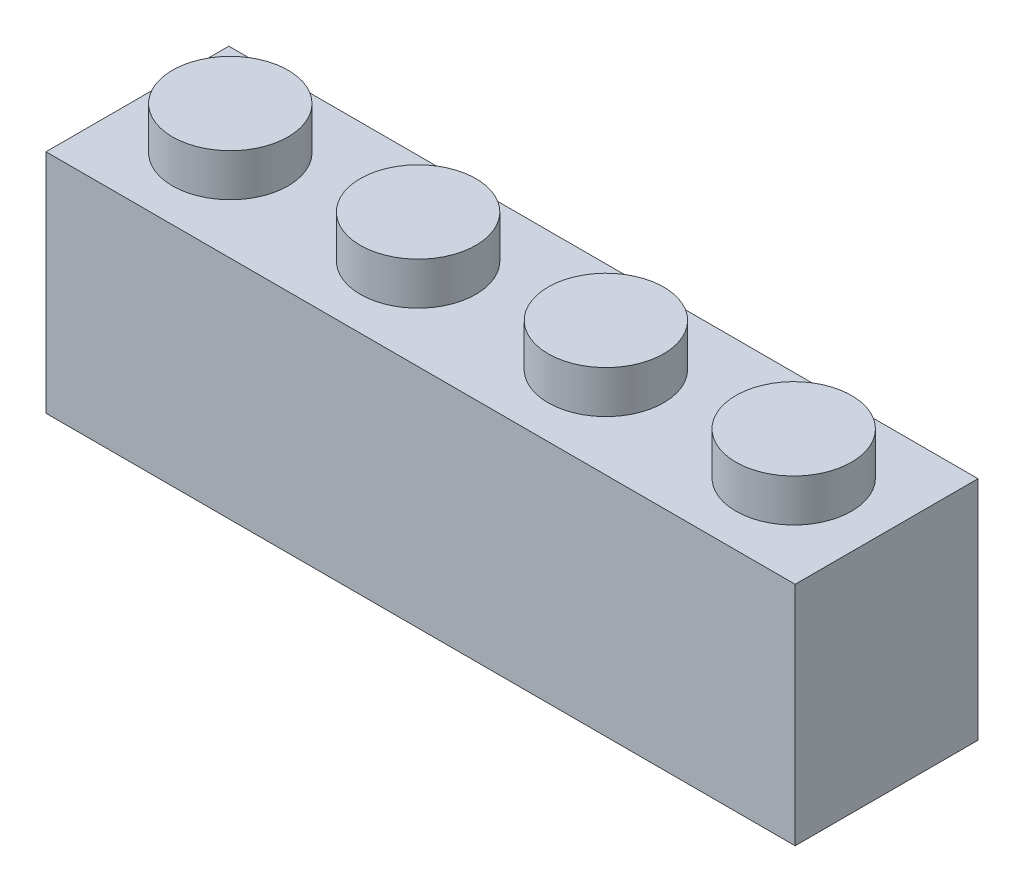
ISO-10303-21;
HEADER;
FILE_DESCRIPTION(('STEP AP214'),'2;1');
FILE_NAME('part.step','',(''),(''),'','','');
FILE_SCHEMA(('AUTOMOTIVE_DESIGN { 1 0 10303 214 1 1 1 1 }'));
ENDSEC;
DATA;
#1=APPLICATION_CONTEXT('core data for automotive mechanical design processes');
#2=APPLICATION_PROTOCOL_DEFINITION('international standard','automotive_design',2000,#1);
#3=PRODUCT_CONTEXT('',#1,'mechanical');
#4=PRODUCT('Part','Part','',(#3));
#5=PRODUCT_RELATED_PRODUCT_CATEGORY('part','',(#4));
#6=PRODUCT_DEFINITION_FORMATION('','',#4);
#7=PRODUCT_DEFINITION_CONTEXT('part definition',#1,'design');
#8=PRODUCT_DEFINITION('design','',#6,#7);
#9=PRODUCT_DEFINITION_SHAPE('','',#8);
#10=(LENGTH_UNIT() NAMED_UNIT(*) SI_UNIT(.MILLI.,.METRE.));
#11=(NAMED_UNIT(*) PLANE_ANGLE_UNIT() SI_UNIT($,.RADIAN.));
#12=(NAMED_UNIT(*) SI_UNIT($,.STERADIAN.) SOLID_ANGLE_UNIT());
#13=UNCERTAINTY_MEASURE_WITH_UNIT(LENGTH_MEASURE(1.E-05),#10,'distance_accuracy_value','');
#14=(GEOMETRIC_REPRESENTATION_CONTEXT(3) GLOBAL_UNCERTAINTY_ASSIGNED_CONTEXT((#13)) GLOBAL_UNIT_ASSIGNED_CONTEXT((#10,
#11,#12)) REPRESENTATION_CONTEXT('',''));
#15=CARTESIAN_POINT('',(0.,0.,0.));
#16=DIRECTION('',(0.,0.,1.));
#17=DIRECTION('',(1.,0.,0.));
#18=AXIS2_PLACEMENT_3D('',#15,#16,#17);
#19=CARTESIAN_POINT('',(15.875,-9.6,-3.875));
#20=DIRECTION('',(1.,0.,0.));
#21=DIRECTION('',(0.,0.,-1.));
#22=AXIS2_PLACEMENT_3D('',#19,#20,#21);
#23=PLANE('',#22);
#24=DIRECTION('',(0.,0.,-1.));
#25=VECTOR('',#24,1.);
#26=CARTESIAN_POINT('',(15.875,0.,-3.875));
#27=LINE('',#26,#25);
#28=CARTESIAN_POINT('',(15.875,0.,3.875));
#29=VERTEX_POINT('',#28);
#30=CARTESIAN_POINT('',(15.875,0.,-3.875));
#31=VERTEX_POINT('',#30);
#32=EDGE_CURVE('E191',#29,#31,#27,.T.);
#33=ORIENTED_EDGE('',*,*,#32,.F.);
#34=DIRECTION('',(0.,1.,0.));
#35=VECTOR('',#34,1.);
#36=CARTESIAN_POINT('',(15.875,-9.6,3.875));
#37=LINE('',#36,#35);
#38=CARTESIAN_POINT('',(15.875,-9.6,3.875));
#39=VERTEX_POINT('',#38);
#40=EDGE_CURVE('E11',#39,#29,#37,.T.);
#41=ORIENTED_EDGE('',*,*,#40,.F.);
#42=DIRECTION('',(0.,0.,-1.));
#43=VECTOR('',#42,1.);
#44=CARTESIAN_POINT('',(15.875,-9.6,-3.875));
#45=LINE('',#44,#43);
#46=CARTESIAN_POINT('',(15.875,-9.6,-3.875));
#47=VERTEX_POINT('',#46);
#48=EDGE_CURVE('E194',#39,#47,#45,.T.);
#49=ORIENTED_EDGE('',*,*,#48,.T.);
#50=DIRECTION('',(0.,1.,0.));
#51=VECTOR('',#50,1.);
#52=CARTESIAN_POINT('',(15.875,-9.6,-3.875));
#53=LINE('',#52,#51);
#54=EDGE_CURVE('E36',#47,#31,#53,.T.);
#55=ORIENTED_EDGE('',*,*,#54,.T.);
#56=EDGE_LOOP('',(#33,#41,#49,#55));
#57=FACE_BOUND('',#56,.T.);
#58=ADVANCED_FACE('F33',(#57),#23,.T.);
#59=CARTESIAN_POINT('',(-15.875,-9.6,3.875));
#60=DIRECTION('',(0.,0.,1.));
#61=DIRECTION('',(1.,0.,0.));
#62=AXIS2_PLACEMENT_3D('',#59,#60,#61);
#63=PLANE('',#62);
#64=DIRECTION('',(1.,0.,0.));
#65=VECTOR('',#64,1.);
#66=CARTESIAN_POINT('',(-15.875,0.,3.875));
#67=LINE('',#66,#65);
#68=CARTESIAN_POINT('',(-15.875,0.,3.875));
#69=VERTEX_POINT('',#68);
#70=EDGE_CURVE('E197',#69,#29,#67,.T.);
#71=ORIENTED_EDGE('',*,*,#70,.F.);
#72=DIRECTION('',(0.,1.,0.));
#73=VECTOR('',#72,1.);
#74=CARTESIAN_POINT('',(-15.875,-9.6,3.875));
#75=LINE('',#74,#73);
#76=CARTESIAN_POINT('',(-15.875,-9.6,3.875));
#77=VERTEX_POINT('',#76);
#78=EDGE_CURVE('E41',#77,#69,#75,.T.);
#79=ORIENTED_EDGE('',*,*,#78,.F.);
#80=DIRECTION('',(1.,0.,0.));
#81=VECTOR('',#80,1.);
#82=CARTESIAN_POINT('',(-15.875,-9.6,3.875));
#83=LINE('',#82,#81);
#84=EDGE_CURVE('E202',#77,#39,#83,.T.);
#85=ORIENTED_EDGE('',*,*,#84,.T.);
#86=ORIENTED_EDGE('',*,*,#40,.T.);
#87=EDGE_LOOP('',(#71,#79,#85,#86));
#88=FACE_BOUND('',#87,.T.);
#89=ADVANCED_FACE('F219',(#88),#63,.T.);
#90=CARTESIAN_POINT('',(-15.875,-9.6,-3.875));
#91=DIRECTION('',(-1.,0.,0.));
#92=DIRECTION('',(0.,0.,1.));
#93=AXIS2_PLACEMENT_3D('',#90,#91,#92);
#94=PLANE('',#93);
#95=DIRECTION('',(0.,0.,1.));
#96=VECTOR('',#95,1.);
#97=CARTESIAN_POINT('',(-15.875,0.,-3.875));
#98=LINE('',#97,#96);
#99=CARTESIAN_POINT('',(-15.875,0.,-3.875));
#100=VERTEX_POINT('',#99);
#101=EDGE_CURVE('E209',#100,#69,#98,.T.);
#102=ORIENTED_EDGE('',*,*,#101,.F.);
#103=DIRECTION('',(0.,1.,0.));
#104=VECTOR('',#103,1.);
#105=CARTESIAN_POINT('',(-15.875,-9.6,-3.875));
#106=LINE('',#105,#104);
#107=CARTESIAN_POINT('',(-15.875,-9.6,-3.875));
#108=VERTEX_POINT('',#107);
#109=EDGE_CURVE('E214',#108,#100,#106,.T.);
#110=ORIENTED_EDGE('',*,*,#109,.F.);
#111=DIRECTION('',(0.,0.,1.));
#112=VECTOR('',#111,1.);
#113=CARTESIAN_POINT('',(-15.875,-9.6,-3.875));
#114=LINE('',#113,#112);
#115=EDGE_CURVE('E199',#108,#77,#114,.T.);
#116=ORIENTED_EDGE('',*,*,#115,.T.);
#117=ORIENTED_EDGE('',*,*,#78,.T.);
#118=EDGE_LOOP('',(#102,#110,#116,#117));
#119=FACE_BOUND('',#118,.T.);
#120=ADVANCED_FACE('F223',(#119),#94,.T.);
#121=CARTESIAN_POINT('',(-15.875,-9.6,-3.875));
#122=DIRECTION('',(0.,0.,-1.));
#123=DIRECTION('',(-1.,0.,0.));
#124=AXIS2_PLACEMENT_3D('',#121,#122,#123);
#125=PLANE('',#124);
#126=DIRECTION('',(-1.,0.,0.));
#127=VECTOR('',#126,1.);
#128=CARTESIAN_POINT('',(-15.875,0.,-3.875));
#129=LINE('',#128,#127);
#130=EDGE_CURVE('E206',#31,#100,#129,.T.);
#131=ORIENTED_EDGE('',*,*,#130,.F.);
#132=ORIENTED_EDGE('',*,*,#54,.F.);
#133=DIRECTION('',(-1.,0.,0.));
#134=VECTOR('',#133,1.);
#135=CARTESIAN_POINT('',(-15.875,-9.6,-3.875));
#136=LINE('',#135,#134);
#137=EDGE_CURVE('E196',#47,#108,#136,.T.);
#138=ORIENTED_EDGE('',*,*,#137,.T.);
#139=ORIENTED_EDGE('',*,*,#109,.T.);
#140=EDGE_LOOP('',(#131,#132,#138,#139));
#141=FACE_BOUND('',#140,.T.);
#142=ADVANCED_FACE('F216',(#141),#125,.T.);
#143=CARTESIAN_POINT('',(0.,-9.6,0.));
#144=DIRECTION('',(0.,1.,0.));
#145=DIRECTION('',(0.,0.,1.));
#146=AXIS2_PLACEMENT_3D('',#143,#144,#145);
#147=PLANE('',#146);
#148=DIRECTION('',(1.,0.,0.));
#149=VECTOR('',#148,1.);
#150=CARTESIAN_POINT('',(0.,-9.6,2.375));
#151=LINE('',#150,#149);
#152=CARTESIAN_POINT('',(-14.375,-9.6,2.375));
#153=VERTEX_POINT('',#152);
#154=CARTESIAN_POINT('',(14.375,-9.6,2.375));
#155=VERTEX_POINT('',#154);
#156=EDGE_CURVE('E165',#153,#155,#151,.T.);
#157=ORIENTED_EDGE('',*,*,#156,.T.);
#158=DIRECTION('',(0.,0.,-1.));
#159=VECTOR('',#158,1.);
#160=CARTESIAN_POINT('',(14.375,-9.6,0.));
#161=LINE('',#160,#159);
#162=CARTESIAN_POINT('',(14.375,-9.6,-2.375));
#163=VERTEX_POINT('',#162);
#164=EDGE_CURVE('E110',#155,#163,#161,.T.);
#165=ORIENTED_EDGE('',*,*,#164,.T.);
#166=DIRECTION('',(-1.,0.,0.));
#167=VECTOR('',#166,1.);
#168=CARTESIAN_POINT('',(0.,-9.6,-2.375));
#169=LINE('',#168,#167);
#170=CARTESIAN_POINT('',(-14.375,-9.6,-2.375));
#171=VERTEX_POINT('',#170);
#172=EDGE_CURVE('E132',#163,#171,#169,.T.);
#173=ORIENTED_EDGE('',*,*,#172,.T.);
#174=DIRECTION('',(0.,0.,1.));
#175=VECTOR('',#174,1.);
#176=CARTESIAN_POINT('',(-14.375,-9.6,0.));
#177=LINE('',#176,#175);
#178=EDGE_CURVE('E49',#171,#153,#177,.T.);
#179=ORIENTED_EDGE('',*,*,#178,.T.);
#180=EDGE_LOOP('',(#157,#165,#173,#179));
#181=FACE_BOUND('',#180,.T.);
#182=ORIENTED_EDGE('',*,*,#48,.F.);
#183=ORIENTED_EDGE('',*,*,#84,.F.);
#184=ORIENTED_EDGE('',*,*,#115,.F.);
#185=ORIENTED_EDGE('',*,*,#137,.F.);
#186=EDGE_LOOP('',(#182,#183,#184,#185));
#187=FACE_BOUND('',#186,.T.);
#188=ADVANCED_FACE('F225',(#181,#187),#147,.F.);
#189=CARTESIAN_POINT('',(0.,0.,0.));
#190=DIRECTION('',(0.,1.,0.));
#191=DIRECTION('',(0.,0.,1.));
#192=AXIS2_PLACEMENT_3D('',#189,#190,#191);
#193=PLANE('',#192);
#194=CARTESIAN_POINT('',(11.94,0.,0.));
#195=DIRECTION('',(0.,1.,0.));
#196=DIRECTION('',(0.,0.,1.));
#197=AXIS2_PLACEMENT_3D('',#194,#195,#196);
#198=CIRCLE('',#197,2.45);
#199=CARTESIAN_POINT('',(11.94,0.,2.45));
#200=VERTEX_POINT('',#199);
#201=EDGE_CURVE('E115',#200,#200,#198,.T.);
#202=ORIENTED_EDGE('',*,*,#201,.F.);
#203=EDGE_LOOP('',(#202));
#204=FACE_BOUND('',#203,.T.);
#205=CARTESIAN_POINT('',(3.98,0.,0.));
#206=DIRECTION('',(0.,1.,0.));
#207=DIRECTION('',(0.,0.,1.));
#208=AXIS2_PLACEMENT_3D('',#205,#206,#207);
#209=CIRCLE('',#208,2.45);
#210=CARTESIAN_POINT('',(3.98,0.,2.45));
#211=VERTEX_POINT('',#210);
#212=EDGE_CURVE('E173',#211,#211,#209,.T.);
#213=ORIENTED_EDGE('',*,*,#212,.F.);
#214=EDGE_LOOP('',(#213));
#215=FACE_BOUND('',#214,.T.);
#216=CARTESIAN_POINT('',(-3.98,0.,0.));
#217=DIRECTION('',(0.,1.,0.));
#218=DIRECTION('',(0.,0.,1.));
#219=AXIS2_PLACEMENT_3D('',#216,#217,#218);
#220=CIRCLE('',#219,2.45);
#221=CARTESIAN_POINT('',(-3.98,0.,2.45));
#222=VERTEX_POINT('',#221);
#223=EDGE_CURVE('E179',#222,#222,#220,.T.);
#224=ORIENTED_EDGE('',*,*,#223,.F.);
#225=EDGE_LOOP('',(#224));
#226=FACE_BOUND('',#225,.T.);
#227=CARTESIAN_POINT('',(-11.94,0.,0.));
#228=DIRECTION('',(0.,1.,0.));
#229=DIRECTION('',(0.,0.,1.));
#230=AXIS2_PLACEMENT_3D('',#227,#228,#229);
#231=CIRCLE('',#230,2.45);
#232=CARTESIAN_POINT('',(-11.94,0.,2.45));
#233=VERTEX_POINT('',#232);
#234=EDGE_CURVE('E185',#233,#233,#231,.T.);
#235=ORIENTED_EDGE('',*,*,#234,.F.);
#236=EDGE_LOOP('',(#235));
#237=FACE_BOUND('',#236,.T.);
#238=ORIENTED_EDGE('',*,*,#32,.T.);
#239=ORIENTED_EDGE('',*,*,#130,.T.);
#240=ORIENTED_EDGE('',*,*,#101,.T.);
#241=ORIENTED_EDGE('',*,*,#70,.T.);
#242=EDGE_LOOP('',(#238,#239,#240,#241));
#243=FACE_BOUND('',#242,.T.);
#244=ADVANCED_FACE('F218',(#204,#215,#226,#237,#243),#193,.T.);
#245=CARTESIAN_POINT('',(-11.94,1.8,0.));
#246=DIRECTION('',(0.,-1.,0.));
#247=DIRECTION('',(0.,0.,-1.));
#248=AXIS2_PLACEMENT_3D('',#245,#246,#247);
#249=CYLINDRICAL_SURFACE('',#248,2.45);
#250=CARTESIAN_POINT('',(-11.94,1.8,0.));
#251=DIRECTION('',(0.,1.,0.));
#252=DIRECTION('',(0.,0.,1.));
#253=AXIS2_PLACEMENT_3D('',#250,#251,#252);
#254=CIRCLE('',#253,2.45);
#255=CARTESIAN_POINT('',(-11.94,1.8,2.45));
#256=VERTEX_POINT('',#255);
#257=EDGE_CURVE('E188',#256,#256,#254,.T.);
#258=ORIENTED_EDGE('',*,*,#257,.F.);
#259=EDGE_LOOP('',(#258));
#260=FACE_BOUND('',#259,.T.);
#261=ORIENTED_EDGE('',*,*,#234,.T.);
#262=EDGE_LOOP('',(#261));
#263=FACE_BOUND('',#262,.T.);
#264=ADVANCED_FACE('F233',(#260,#263),#249,.T.);
#265=CARTESIAN_POINT('',(-11.94,1.8,0.));
#266=DIRECTION('',(0.,1.,0.));
#267=DIRECTION('',(0.,0.,1.));
#268=AXIS2_PLACEMENT_3D('',#265,#266,#267);
#269=PLANE('',#268);
#270=ORIENTED_EDGE('',*,*,#257,.T.);
#271=EDGE_LOOP('',(#270));
#272=FACE_BOUND('',#271,.T.);
#273=ADVANCED_FACE('F268',(#272),#269,.T.);
#274=CARTESIAN_POINT('',(-3.98,1.8,0.));
#275=DIRECTION('',(0.,-1.,0.));
#276=DIRECTION('',(0.,0.,-1.));
#277=AXIS2_PLACEMENT_3D('',#274,#275,#276);
#278=CYLINDRICAL_SURFACE('',#277,2.45);
#279=CARTESIAN_POINT('',(-3.98,1.8,0.));
#280=DIRECTION('',(0.,1.,0.));
#281=DIRECTION('',(0.,0.,1.));
#282=AXIS2_PLACEMENT_3D('',#279,#280,#281);
#283=CIRCLE('',#282,2.45);
#284=CARTESIAN_POINT('',(-3.98,1.8,2.45));
#285=VERTEX_POINT('',#284);
#286=EDGE_CURVE('E182',#285,#285,#283,.T.);
#287=ORIENTED_EDGE('',*,*,#286,.F.);
#288=EDGE_LOOP('',(#287));
#289=FACE_BOUND('',#288,.T.);
#290=ORIENTED_EDGE('',*,*,#223,.T.);
#291=EDGE_LOOP('',(#290));
#292=FACE_BOUND('',#291,.T.);
#293=ADVANCED_FACE('F277',(#289,#292),#278,.T.);
#294=CARTESIAN_POINT('',(-3.98,1.8,0.));
#295=DIRECTION('',(0.,1.,0.));
#296=DIRECTION('',(0.,0.,1.));
#297=AXIS2_PLACEMENT_3D('',#294,#295,#296);
#298=PLANE('',#297);
#299=ORIENTED_EDGE('',*,*,#286,.T.);
#300=EDGE_LOOP('',(#299));
#301=FACE_BOUND('',#300,.T.);
#302=ADVANCED_FACE('F287',(#301),#298,.T.);
#303=CARTESIAN_POINT('',(3.98,1.8,0.));
#304=DIRECTION('',(0.,-1.,0.));
#305=DIRECTION('',(0.,0.,-1.));
#306=AXIS2_PLACEMENT_3D('',#303,#304,#305);
#307=CYLINDRICAL_SURFACE('',#306,2.45);
#308=CARTESIAN_POINT('',(3.98,1.8,0.));
#309=DIRECTION('',(0.,1.,0.));
#310=DIRECTION('',(0.,0.,1.));
#311=AXIS2_PLACEMENT_3D('',#308,#309,#310);
#312=CIRCLE('',#311,2.45);
#313=CARTESIAN_POINT('',(3.98,1.8,2.45));
#314=VERTEX_POINT('',#313);
#315=EDGE_CURVE('E176',#314,#314,#312,.T.);
#316=ORIENTED_EDGE('',*,*,#315,.F.);
#317=EDGE_LOOP('',(#316));
#318=FACE_BOUND('',#317,.T.);
#319=ORIENTED_EDGE('',*,*,#212,.T.);
#320=EDGE_LOOP('',(#319));
#321=FACE_BOUND('',#320,.T.);
#322=ADVANCED_FACE('F297',(#318,#321),#307,.T.);
#323=CARTESIAN_POINT('',(3.98,1.8,0.));
#324=DIRECTION('',(0.,1.,0.));
#325=DIRECTION('',(0.,0.,1.));
#326=AXIS2_PLACEMENT_3D('',#323,#324,#325);
#327=PLANE('',#326);
#328=ORIENTED_EDGE('',*,*,#315,.T.);
#329=EDGE_LOOP('',(#328));
#330=FACE_BOUND('',#329,.T.);
#331=ADVANCED_FACE('F307',(#330),#327,.T.);
#332=CARTESIAN_POINT('',(11.94,1.8,0.));
#333=DIRECTION('',(0.,-1.,0.));
#334=DIRECTION('',(0.,0.,-1.));
#335=AXIS2_PLACEMENT_3D('',#332,#333,#334);
#336=CYLINDRICAL_SURFACE('',#335,2.45);
#337=CARTESIAN_POINT('',(11.94,1.8,0.));
#338=DIRECTION('',(0.,1.,0.));
#339=DIRECTION('',(0.,0.,1.));
#340=AXIS2_PLACEMENT_3D('',#337,#338,#339);
#341=CIRCLE('',#340,2.45);
#342=CARTESIAN_POINT('',(11.94,1.8,2.45));
#343=VERTEX_POINT('',#342);
#344=EDGE_CURVE('E170',#343,#343,#341,.T.);
#345=ORIENTED_EDGE('',*,*,#344,.F.);
#346=EDGE_LOOP('',(#345));
#347=FACE_BOUND('',#346,.T.);
#348=ORIENTED_EDGE('',*,*,#201,.T.);
#349=EDGE_LOOP('',(#348));
#350=FACE_BOUND('',#349,.T.);
#351=ADVANCED_FACE('F317',(#347,#350),#336,.T.);
#352=CARTESIAN_POINT('',(11.94,1.8,0.));
#353=DIRECTION('',(0.,1.,0.));
#354=DIRECTION('',(0.,0.,1.));
#355=AXIS2_PLACEMENT_3D('',#352,#353,#354);
#356=PLANE('',#355);
#357=ORIENTED_EDGE('',*,*,#344,.T.);
#358=EDGE_LOOP('',(#357));
#359=FACE_BOUND('',#358,.T.);
#360=ADVANCED_FACE('F327',(#359),#356,.T.);
#361=CARTESIAN_POINT('',(14.375,-9.6,-3.875));
#362=DIRECTION('',(1.,0.,0.));
#363=DIRECTION('',(0.,0.,-1.));
#364=AXIS2_PLACEMENT_3D('',#361,#362,#363);
#365=PLANE('',#364);
#366=DIRECTION('',(0.,0.,-1.));
#367=VECTOR('',#366,1.);
#368=CARTESIAN_POINT('',(14.375,-1.5,0.));
#369=LINE('',#368,#367);
#370=CARTESIAN_POINT('',(14.375,-1.5,2.375));
#371=VERTEX_POINT('',#370);
#372=CARTESIAN_POINT('',(14.375,-1.5,-2.375));
#373=VERTEX_POINT('',#372);
#374=EDGE_CURVE('E108',#371,#373,#369,.T.);
#375=ORIENTED_EDGE('',*,*,#374,.T.);
#376=DIRECTION('',(0.,1.,0.));
#377=VECTOR('',#376,1.);
#378=CARTESIAN_POINT('',(14.375,-9.6,-2.375));
#379=LINE('',#378,#377);
#380=EDGE_CURVE('E137',#163,#373,#379,.T.);
#381=ORIENTED_EDGE('',*,*,#380,.F.);
#382=ORIENTED_EDGE('',*,*,#164,.F.);
#383=DIRECTION('',(0.,1.,0.));
#384=VECTOR('',#383,1.);
#385=CARTESIAN_POINT('',(14.375,-9.6,2.375));
#386=LINE('',#385,#384);
#387=EDGE_CURVE('E105',#155,#371,#386,.T.);
#388=ORIENTED_EDGE('',*,*,#387,.T.);
#389=EDGE_LOOP('',(#375,#381,#382,#388));
#390=FACE_BOUND('',#389,.T.);
#391=ADVANCED_FACE('F107',(#390),#365,.F.);
#392=CARTESIAN_POINT('',(-15.875,-9.6,2.375));
#393=DIRECTION('',(0.,0.,1.));
#394=DIRECTION('',(1.,0.,0.));
#395=AXIS2_PLACEMENT_3D('',#392,#393,#394);
#396=PLANE('',#395);
#397=DIRECTION('',(1.,0.,0.));
#398=VECTOR('',#397,1.);
#399=CARTESIAN_POINT('',(0.,-1.5,2.375));
#400=LINE('',#399,#398);
#401=CARTESIAN_POINT('',(-14.375,-1.5,2.375));
#402=VERTEX_POINT('',#401);
#403=EDGE_CURVE('E123',#402,#371,#400,.T.);
#404=ORIENTED_EDGE('',*,*,#403,.T.);
#405=ORIENTED_EDGE('',*,*,#387,.F.);
#406=ORIENTED_EDGE('',*,*,#156,.F.);
#407=DIRECTION('',(0.,1.,0.));
#408=VECTOR('',#407,1.);
#409=CARTESIAN_POINT('',(-14.375,-9.6,2.375));
#410=LINE('',#409,#408);
#411=EDGE_CURVE('E116',#153,#402,#410,.T.);
#412=ORIENTED_EDGE('',*,*,#411,.T.);
#413=EDGE_LOOP('',(#404,#405,#406,#412));
#414=FACE_BOUND('',#413,.T.);
#415=ADVANCED_FACE('F128',(#414),#396,.F.);
#416=CARTESIAN_POINT('',(-14.375,-9.6,-3.875));
#417=DIRECTION('',(-1.,0.,0.));
#418=DIRECTION('',(0.,0.,1.));
#419=AXIS2_PLACEMENT_3D('',#416,#417,#418);
#420=PLANE('',#419);
#421=DIRECTION('',(0.,0.,1.));
#422=VECTOR('',#421,1.);
#423=CARTESIAN_POINT('',(-14.375,-1.5,0.));
#424=LINE('',#423,#422);
#425=CARTESIAN_POINT('',(-14.375,-1.5,-2.375));
#426=VERTEX_POINT('',#425);
#427=EDGE_CURVE('E130',#426,#402,#424,.T.);
#428=ORIENTED_EDGE('',*,*,#427,.T.);
#429=ORIENTED_EDGE('',*,*,#411,.F.);
#430=ORIENTED_EDGE('',*,*,#178,.F.);
#431=DIRECTION('',(0.,1.,0.));
#432=VECTOR('',#431,1.);
#433=CARTESIAN_POINT('',(-14.375,-9.6,-2.375));
#434=LINE('',#433,#432);
#435=EDGE_CURVE('E138',#171,#426,#434,.T.);
#436=ORIENTED_EDGE('',*,*,#435,.T.);
#437=EDGE_LOOP('',(#428,#429,#430,#436));
#438=FACE_BOUND('',#437,.T.);
#439=ADVANCED_FACE('F357',(#438),#420,.F.);
#440=CARTESIAN_POINT('',(-15.875,-9.6,-2.375));
#441=DIRECTION('',(0.,0.,-1.));
#442=DIRECTION('',(-1.,0.,0.));
#443=AXIS2_PLACEMENT_3D('',#440,#441,#442);
#444=PLANE('',#443);
#445=DIRECTION('',(-1.,0.,0.));
#446=VECTOR('',#445,1.);
#447=CARTESIAN_POINT('',(0.,-1.5,-2.375));
#448=LINE('',#447,#446);
#449=EDGE_CURVE('E125',#373,#426,#448,.T.);
#450=ORIENTED_EDGE('',*,*,#449,.T.);
#451=ORIENTED_EDGE('',*,*,#435,.F.);
#452=ORIENTED_EDGE('',*,*,#172,.F.);
#453=ORIENTED_EDGE('',*,*,#380,.T.);
#454=EDGE_LOOP('',(#450,#451,#452,#453));
#455=FACE_BOUND('',#454,.T.);
#456=ADVANCED_FACE('F366',(#455),#444,.F.);
#457=CARTESIAN_POINT('',(0.,-1.5,0.));
#458=DIRECTION('',(0.,1.,0.));
#459=DIRECTION('',(0.,0.,1.));
#460=AXIS2_PLACEMENT_3D('',#457,#458,#459);
#461=PLANE('',#460);
#462=CARTESIAN_POINT('',(11.94,-1.5,0.));
#463=DIRECTION('',(0.,1.,0.));
#464=DIRECTION('',(0.,0.,1.));
#465=AXIS2_PLACEMENT_3D('',#462,#463,#464);
#466=CIRCLE('',#465,0.950000000000001);
#467=CARTESIAN_POINT('',(11.94,-1.5,0.950000000000001));
#468=VERTEX_POINT('',#467);
#469=EDGE_CURVE('E142',#468,#468,#466,.T.);
#470=ORIENTED_EDGE('',*,*,#469,.T.);
#471=EDGE_LOOP('',(#470));
#472=FACE_BOUND('',#471,.T.);
#473=CARTESIAN_POINT('',(3.98,-1.5,0.));
#474=DIRECTION('',(0.,1.,0.));
#475=DIRECTION('',(0.,0.,1.));
#476=AXIS2_PLACEMENT_3D('',#473,#474,#475);
#477=CIRCLE('',#476,0.950000000000001);
#478=CARTESIAN_POINT('',(3.98,-1.5,0.950000000000001));
#479=VERTEX_POINT('',#478);
#480=EDGE_CURVE('E146',#479,#479,#477,.T.);
#481=ORIENTED_EDGE('',*,*,#480,.T.);
#482=EDGE_LOOP('',(#481));
#483=FACE_BOUND('',#482,.T.);
#484=CARTESIAN_POINT('',(-3.98,-1.5,0.));
#485=DIRECTION('',(0.,1.,0.));
#486=DIRECTION('',(0.,0.,1.));
#487=AXIS2_PLACEMENT_3D('',#484,#485,#486);
#488=CIRCLE('',#487,0.950000000000001);
#489=CARTESIAN_POINT('',(-3.98,-1.5,0.950000000000001));
#490=VERTEX_POINT('',#489);
#491=EDGE_CURVE('E150',#490,#490,#488,.T.);
#492=ORIENTED_EDGE('',*,*,#491,.T.);
#493=EDGE_LOOP('',(#492));
#494=FACE_BOUND('',#493,.T.);
#495=CARTESIAN_POINT('',(-11.94,-1.5,0.));
#496=DIRECTION('',(0.,1.,0.));
#497=DIRECTION('',(0.,0.,1.));
#498=AXIS2_PLACEMENT_3D('',#495,#496,#497);
#499=CIRCLE('',#498,0.950000000000001);
#500=CARTESIAN_POINT('',(-11.94,-1.5,0.950000000000001));
#501=VERTEX_POINT('',#500);
#502=EDGE_CURVE('E154',#501,#501,#499,.T.);
#503=ORIENTED_EDGE('',*,*,#502,.T.);
#504=EDGE_LOOP('',(#503));
#505=FACE_BOUND('',#504,.T.);
#506=ORIENTED_EDGE('',*,*,#374,.F.);
#507=ORIENTED_EDGE('',*,*,#403,.F.);
#508=ORIENTED_EDGE('',*,*,#427,.F.);
#509=ORIENTED_EDGE('',*,*,#449,.F.);
#510=EDGE_LOOP('',(#506,#507,#508,#509));
#511=FACE_BOUND('',#510,.T.);
#512=ADVANCED_FACE('F121',(#472,#483,#494,#505,#511),#461,.F.);
#513=CARTESIAN_POINT('',(-11.94,1.8,0.));
#514=DIRECTION('',(0.,-1.,0.));
#515=DIRECTION('',(0.,0.,-1.));
#516=AXIS2_PLACEMENT_3D('',#513,#514,#515);
#517=CYLINDRICAL_SURFACE('',#516,0.950000000000001);
#518=CARTESIAN_POINT('',(-11.94,0.3,0.));
#519=DIRECTION('',(0.,1.,0.));
#520=DIRECTION('',(0.,0.,1.));
#521=AXIS2_PLACEMENT_3D('',#518,#519,#520);
#522=CIRCLE('',#521,0.950000000000001);
#523=CARTESIAN_POINT('',(-11.94,0.3,0.950000000000001));
#524=VERTEX_POINT('',#523);
#525=EDGE_CURVE('E126',#524,#524,#522,.T.);
#526=ORIENTED_EDGE('',*,*,#525,.T.);
#527=EDGE_LOOP('',(#526));
#528=FACE_BOUND('',#527,.T.);
#529=ORIENTED_EDGE('',*,*,#502,.F.);
#530=EDGE_LOOP('',(#529));
#531=FACE_BOUND('',#530,.T.);
#532=ADVANCED_FACE('F384',(#528,#531),#517,.F.);
#533=CARTESIAN_POINT('',(-11.94,0.3,0.));
#534=DIRECTION('',(0.,1.,0.));
#535=DIRECTION('',(0.,0.,1.));
#536=AXIS2_PLACEMENT_3D('',#533,#534,#535);
#537=PLANE('',#536);
#538=ORIENTED_EDGE('',*,*,#525,.F.);
#539=EDGE_LOOP('',(#538));
#540=FACE_BOUND('',#539,.T.);
#541=ADVANCED_FACE('F394',(#540),#537,.F.);
#542=CARTESIAN_POINT('',(-3.98,1.8,0.));
#543=DIRECTION('',(0.,-1.,0.));
#544=DIRECTION('',(0.,0.,-1.));
#545=AXIS2_PLACEMENT_3D('',#542,#543,#544);
#546=CYLINDRICAL_SURFACE('',#545,0.950000000000001);
#547=CARTESIAN_POINT('',(-3.98,0.3,0.));
#548=DIRECTION('',(0.,1.,0.));
#549=DIRECTION('',(0.,0.,1.));
#550=AXIS2_PLACEMENT_3D('',#547,#548,#549);
#551=CIRCLE('',#550,0.950000000000001);
#552=CARTESIAN_POINT('',(-3.98,0.3,0.950000000000001));
#553=VERTEX_POINT('',#552);
#554=EDGE_CURVE('E153',#553,#553,#551,.T.);
#555=ORIENTED_EDGE('',*,*,#554,.T.);
#556=EDGE_LOOP('',(#555));
#557=FACE_BOUND('',#556,.T.);
#558=ORIENTED_EDGE('',*,*,#491,.F.);
#559=EDGE_LOOP('',(#558));
#560=FACE_BOUND('',#559,.T.);
#561=ADVANCED_FACE('F404',(#557,#560),#546,.F.);
#562=CARTESIAN_POINT('',(-3.98,0.3,0.));
#563=DIRECTION('',(0.,1.,0.));
#564=DIRECTION('',(0.,0.,1.));
#565=AXIS2_PLACEMENT_3D('',#562,#563,#564);
#566=PLANE('',#565);
#567=ORIENTED_EDGE('',*,*,#554,.F.);
#568=EDGE_LOOP('',(#567));
#569=FACE_BOUND('',#568,.T.);
#570=ADVANCED_FACE('F414',(#569),#566,.F.);
#571=CARTESIAN_POINT('',(3.98,1.8,0.));
#572=DIRECTION('',(0.,-1.,0.));
#573=DIRECTION('',(0.,0.,-1.));
#574=AXIS2_PLACEMENT_3D('',#571,#572,#573);
#575=CYLINDRICAL_SURFACE('',#574,0.950000000000001);
#576=CARTESIAN_POINT('',(3.98,0.3,0.));
#577=DIRECTION('',(0.,1.,0.));
#578=DIRECTION('',(0.,0.,1.));
#579=AXIS2_PLACEMENT_3D('',#576,#577,#578);
#580=CIRCLE('',#579,0.950000000000001);
#581=CARTESIAN_POINT('',(3.98,0.3,0.950000000000001));
#582=VERTEX_POINT('',#581);
#583=EDGE_CURVE('E149',#582,#582,#580,.T.);
#584=ORIENTED_EDGE('',*,*,#583,.T.);
#585=EDGE_LOOP('',(#584));
#586=FACE_BOUND('',#585,.T.);
#587=ORIENTED_EDGE('',*,*,#480,.F.);
#588=EDGE_LOOP('',(#587));
#589=FACE_BOUND('',#588,.T.);
#590=ADVANCED_FACE('F424',(#586,#589),#575,.F.);
#591=CARTESIAN_POINT('',(3.98,0.3,0.));
#592=DIRECTION('',(0.,1.,0.));
#593=DIRECTION('',(0.,0.,1.));
#594=AXIS2_PLACEMENT_3D('',#591,#592,#593);
#595=PLANE('',#594);
#596=ORIENTED_EDGE('',*,*,#583,.F.);
#597=EDGE_LOOP('',(#596));
#598=FACE_BOUND('',#597,.T.);
#599=ADVANCED_FACE('F434',(#598),#595,.F.);
#600=CARTESIAN_POINT('',(11.94,1.8,0.));
#601=DIRECTION('',(0.,-1.,0.));
#602=DIRECTION('',(0.,0.,-1.));
#603=AXIS2_PLACEMENT_3D('',#600,#601,#602);
#604=CYLINDRICAL_SURFACE('',#603,0.950000000000001);
#605=CARTESIAN_POINT('',(11.94,0.3,0.));
#606=DIRECTION('',(0.,1.,0.));
#607=DIRECTION('',(0.,0.,1.));
#608=AXIS2_PLACEMENT_3D('',#605,#606,#607);
#609=CIRCLE('',#608,0.950000000000001);
#610=CARTESIAN_POINT('',(11.94,0.3,0.950000000000001));
#611=VERTEX_POINT('',#610);
#612=EDGE_CURVE('E145',#611,#611,#609,.T.);
#613=ORIENTED_EDGE('',*,*,#612,.T.);
#614=EDGE_LOOP('',(#613));
#615=FACE_BOUND('',#614,.T.);
#616=ORIENTED_EDGE('',*,*,#469,.F.);
#617=EDGE_LOOP('',(#616));
#618=FACE_BOUND('',#617,.T.);
#619=ADVANCED_FACE('F444',(#615,#618),#604,.F.);
#620=CARTESIAN_POINT('',(11.94,0.3,0.));
#621=DIRECTION('',(0.,1.,0.));
#622=DIRECTION('',(0.,0.,1.));
#623=AXIS2_PLACEMENT_3D('',#620,#621,#622);
#624=PLANE('',#623);
#625=ORIENTED_EDGE('',*,*,#612,.F.);
#626=EDGE_LOOP('',(#625));
#627=FACE_BOUND('',#626,.T.);
#628=ADVANCED_FACE('F454',(#627),#624,.F.);
#629=CLOSED_SHELL('',(#58,#89,#120,#142,#188,#244,#264,#273,#293,#302,#322,#331,#351,#360,#391,
#415,#439,#456,#512,#532,#541,#561,#570,#590,#599,#619,#628));
#630=MANIFOLD_SOLID_BREP('B2',#629);
#631=ADVANCED_BREP_SHAPE_REPRESENTATION('',(#18,#630),#14);
#632=SHAPE_DEFINITION_REPRESENTATION(#9,#631);
ENDSEC;
END-ISO-10303-21;
